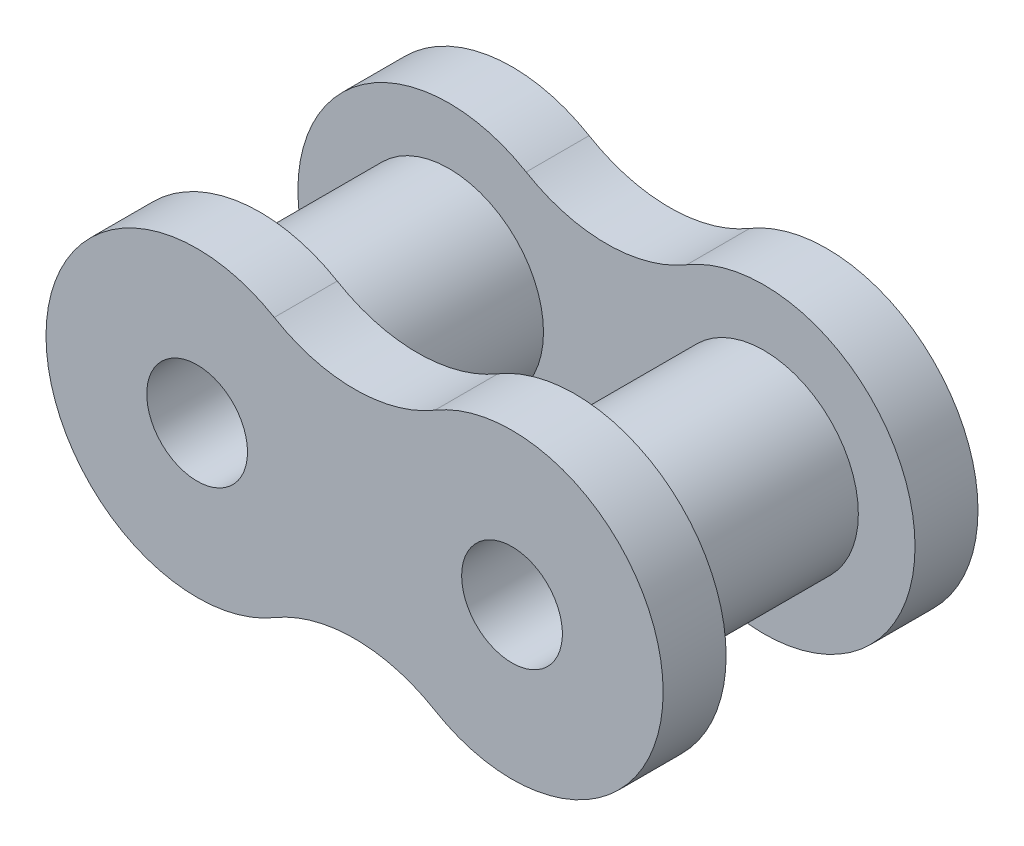
ISO-10303-21;
HEADER;
FILE_DESCRIPTION(('STEP AP214'),'2;1');
FILE_NAME('part.step','',(''),(''),'','','');
FILE_SCHEMA(('AUTOMOTIVE_DESIGN { 1 0 10303 214 1 1 1 1 }'));
ENDSEC;
DATA;
#1=APPLICATION_CONTEXT('core data for automotive mechanical design processes');
#2=APPLICATION_PROTOCOL_DEFINITION('international standard','automotive_design',2000,#1);
#3=PRODUCT_CONTEXT('',#1,'mechanical');
#4=PRODUCT('Part','Part','',(#3));
#5=PRODUCT_RELATED_PRODUCT_CATEGORY('part','',(#4));
#6=PRODUCT_DEFINITION_FORMATION('','',#4);
#7=PRODUCT_DEFINITION_CONTEXT('part definition',#1,'design');
#8=PRODUCT_DEFINITION('design','',#6,#7);
#9=PRODUCT_DEFINITION_SHAPE('','',#8);
#10=(LENGTH_UNIT() NAMED_UNIT(*) SI_UNIT(.MILLI.,.METRE.));
#11=(NAMED_UNIT(*) PLANE_ANGLE_UNIT() SI_UNIT($,.RADIAN.));
#12=(NAMED_UNIT(*) SI_UNIT($,.STERADIAN.) SOLID_ANGLE_UNIT());
#13=UNCERTAINTY_MEASURE_WITH_UNIT(LENGTH_MEASURE(1.E-05),#10,'distance_accuracy_value','');
#14=(GEOMETRIC_REPRESENTATION_CONTEXT(3) GLOBAL_UNCERTAINTY_ASSIGNED_CONTEXT((#13)) GLOBAL_UNIT_ASSIGNED_CONTEXT((#10,
#11,#12)) REPRESENTATION_CONTEXT('',''));
#15=CARTESIAN_POINT('',(0.,0.,0.));
#16=DIRECTION('',(0.,0.,1.));
#17=DIRECTION('',(1.,0.,0.));
#18=AXIS2_PLACEMENT_3D('',#15,#16,#17);
#19=CARTESIAN_POINT('',(0.125,0.210713075057055,0.));
#20=DIRECTION('',(0.,0.,1.));
#21=DIRECTION('',(1.,0.,0.));
#22=AXIS2_PLACEMENT_3D('',#19,#20,#21);
#23=PLANE('',#22);
#24=CARTESIAN_POINT('',(-0.25,0.,0.));
#25=DIRECTION('',(0.,0.,1.));
#26=DIRECTION('',(1.,0.,0.));
#27=AXIS2_PLACEMENT_3D('',#24,#25,#26);
#28=CIRCLE('',#27,0.15);
#29=CARTESIAN_POINT('',(-0.1,0.,0.));
#30=VERTEX_POINT('',#29);
#31=EDGE_CURVE('E180',#30,#30,#28,.T.);
#32=ORIENTED_EDGE('',*,*,#31,.F.);
#33=EDGE_LOOP('',(#32));
#34=FACE_BOUND('',#33,.T.);
#35=CARTESIAN_POINT('',(0.,0.42142615011411,0.));
#36=DIRECTION('',(0.,0.,-1.));
#37=DIRECTION('',(1.,0.,0.));
#38=AXIS2_PLACEMENT_3D('',#35,#36,#37);
#39=CIRCLE('',#38,0.25);
#40=CARTESIAN_POINT('',(0.127551020408163,0.206412808219156,0.));
#41=VERTEX_POINT('',#40);
#42=CARTESIAN_POINT('',(-0.127551020408163,0.206412808219156,0.));
#43=VERTEX_POINT('',#42);
#44=EDGE_CURVE('E199',#41,#43,#39,.T.);
#45=ORIENTED_EDGE('',*,*,#44,.T.);
#46=CARTESIAN_POINT('',(-0.25,0.,0.));
#47=DIRECTION('',(0.,0.,1.));
#48=DIRECTION('',(1.,0.,0.));
#49=AXIS2_PLACEMENT_3D('',#46,#47,#48);
#50=CIRCLE('',#49,0.24);
#51=CARTESIAN_POINT('',(-0.127551020408163,-0.206412808219156,0.));
#52=VERTEX_POINT('',#51);
#53=EDGE_CURVE('E216',#43,#52,#50,.T.);
#54=ORIENTED_EDGE('',*,*,#53,.T.);
#55=CARTESIAN_POINT('',(0.,-0.42142615011411,0.));
#56=DIRECTION('',(0.,0.,-1.));
#57=DIRECTION('',(-1.,0.,0.));
#58=AXIS2_PLACEMENT_3D('',#55,#56,#57);
#59=CIRCLE('',#58,0.25);
#60=CARTESIAN_POINT('',(0.127551020408163,-0.206412808219156,0.));
#61=VERTEX_POINT('',#60);
#62=EDGE_CURVE('E220',#52,#61,#59,.T.);
#63=ORIENTED_EDGE('',*,*,#62,.T.);
#64=CARTESIAN_POINT('',(0.25,0.,0.));
#65=DIRECTION('',(0.,0.,1.));
#66=DIRECTION('',(-1.,0.,0.));
#67=AXIS2_PLACEMENT_3D('',#64,#65,#66);
#68=CIRCLE('',#67,0.24);
#69=EDGE_CURVE('E204',#61,#41,#68,.T.);
#70=ORIENTED_EDGE('',*,*,#69,.T.);
#71=EDGE_LOOP('',(#45,#54,#63,#70));
#72=FACE_BOUND('',#71,.T.);
#73=CARTESIAN_POINT('',(0.25,0.,0.));
#74=DIRECTION('',(0.,0.,1.));
#75=DIRECTION('',(-1.,0.,0.));
#76=AXIS2_PLACEMENT_3D('',#73,#74,#75);
#77=CIRCLE('',#76,0.15);
#78=CARTESIAN_POINT('',(0.1,0.,0.));
#79=VERTEX_POINT('',#78);
#80=EDGE_CURVE('E176',#79,#79,#77,.T.);
#81=ORIENTED_EDGE('',*,*,#80,.F.);
#82=EDGE_LOOP('',(#81));
#83=FACE_BOUND('',#82,.T.);
#84=ADVANCED_FACE('F43',(#34,#72,#83),#23,.T.);
#85=CARTESIAN_POINT('',(0.,0.42142615011411,-0.1));
#86=DIRECTION('',(0.,0.,1.));
#87=DIRECTION('',(1.,0.,0.));
#88=AXIS2_PLACEMENT_3D('',#85,#86,#87);
#89=CYLINDRICAL_SURFACE('',#88,0.25);
#90=ORIENTED_EDGE('',*,*,#44,.F.);
#91=DIRECTION('',(0.,0.,1.));
#92=VECTOR('',#91,1.);
#93=CARTESIAN_POINT('',(0.127551020408163,0.206412808219156,-0.1));
#94=LINE('',#93,#92);
#95=CARTESIAN_POINT('',(0.127551020408163,0.206412808219156,-0.1));
#96=VERTEX_POINT('',#95);
#97=EDGE_CURVE('E11',#96,#41,#94,.T.);
#98=ORIENTED_EDGE('',*,*,#97,.F.);
#99=CARTESIAN_POINT('',(0.,0.42142615011411,-0.1));
#100=DIRECTION('',(0.,0.,-1.));
#101=DIRECTION('',(1.,0.,0.));
#102=AXIS2_PLACEMENT_3D('',#99,#100,#101);
#103=CIRCLE('',#102,0.25);
#104=CARTESIAN_POINT('',(-0.127551020408163,0.206412808219156,-0.1));
#105=VERTEX_POINT('',#104);
#106=EDGE_CURVE('E200',#96,#105,#103,.T.);
#107=ORIENTED_EDGE('',*,*,#106,.T.);
#108=DIRECTION('',(0.,0.,1.));
#109=VECTOR('',#108,1.);
#110=CARTESIAN_POINT('',(-0.127551020408163,0.206412808219156,-0.1));
#111=LINE('',#110,#109);
#112=EDGE_CURVE('E47',#105,#43,#111,.T.);
#113=ORIENTED_EDGE('',*,*,#112,.T.);
#114=EDGE_LOOP('',(#90,#98,#107,#113));
#115=FACE_BOUND('',#114,.T.);
#116=ADVANCED_FACE('F45',(#115),#89,.F.);
#117=CARTESIAN_POINT('',(0.25,0.,-0.1));
#118=DIRECTION('',(0.,0.,1.));
#119=DIRECTION('',(1.,0.,0.));
#120=AXIS2_PLACEMENT_3D('',#117,#118,#119);
#121=CYLINDRICAL_SURFACE('',#120,0.24);
#122=ORIENTED_EDGE('',*,*,#69,.F.);
#123=DIRECTION('',(0.,0.,1.));
#124=VECTOR('',#123,1.);
#125=CARTESIAN_POINT('',(0.127551020408163,-0.206412808219156,-0.1));
#126=LINE('',#125,#124);
#127=CARTESIAN_POINT('',(0.127551020408163,-0.206412808219156,-0.1));
#128=VERTEX_POINT('',#127);
#129=EDGE_CURVE('E54',#128,#61,#126,.T.);
#130=ORIENTED_EDGE('',*,*,#129,.F.);
#131=CARTESIAN_POINT('',(0.25,0.,-0.1));
#132=DIRECTION('',(0.,0.,1.));
#133=DIRECTION('',(-1.,0.,0.));
#134=AXIS2_PLACEMENT_3D('',#131,#132,#133);
#135=CIRCLE('',#134,0.24);
#136=EDGE_CURVE('E210',#128,#96,#135,.T.);
#137=ORIENTED_EDGE('',*,*,#136,.T.);
#138=ORIENTED_EDGE('',*,*,#97,.T.);
#139=EDGE_LOOP('',(#122,#130,#137,#138));
#140=FACE_BOUND('',#139,.T.);
#141=ADVANCED_FACE('F233',(#140),#121,.T.);
#142=CARTESIAN_POINT('',(0.,-0.42142615011411,-0.1));
#143=DIRECTION('',(0.,0.,1.));
#144=DIRECTION('',(1.,0.,0.));
#145=AXIS2_PLACEMENT_3D('',#142,#143,#144);
#146=CYLINDRICAL_SURFACE('',#145,0.25);
#147=ORIENTED_EDGE('',*,*,#62,.F.);
#148=DIRECTION('',(0.,0.,1.));
#149=VECTOR('',#148,1.);
#150=CARTESIAN_POINT('',(-0.127551020408163,-0.206412808219156,-0.1));
#151=LINE('',#150,#149);
#152=CARTESIAN_POINT('',(-0.127551020408163,-0.206412808219156,-0.1));
#153=VERTEX_POINT('',#152);
#154=EDGE_CURVE('E227',#153,#52,#151,.T.);
#155=ORIENTED_EDGE('',*,*,#154,.F.);
#156=CARTESIAN_POINT('',(0.,-0.42142615011411,-0.1));
#157=DIRECTION('',(0.,0.,-1.));
#158=DIRECTION('',(-1.,0.,0.));
#159=AXIS2_PLACEMENT_3D('',#156,#157,#158);
#160=CIRCLE('',#159,0.25);
#161=EDGE_CURVE('E207',#153,#128,#160,.T.);
#162=ORIENTED_EDGE('',*,*,#161,.T.);
#163=ORIENTED_EDGE('',*,*,#129,.T.);
#164=EDGE_LOOP('',(#147,#155,#162,#163));
#165=FACE_BOUND('',#164,.T.);
#166=ADVANCED_FACE('F236',(#165),#146,.F.);
#167=CARTESIAN_POINT('',(-0.25,0.,-0.1));
#168=DIRECTION('',(0.,0.,1.));
#169=DIRECTION('',(1.,0.,0.));
#170=AXIS2_PLACEMENT_3D('',#167,#168,#169);
#171=CYLINDRICAL_SURFACE('',#170,0.24);
#172=ORIENTED_EDGE('',*,*,#53,.F.);
#173=ORIENTED_EDGE('',*,*,#112,.F.);
#174=CARTESIAN_POINT('',(-0.25,0.,-0.1));
#175=DIRECTION('',(0.,0.,1.));
#176=DIRECTION('',(1.,0.,0.));
#177=AXIS2_PLACEMENT_3D('',#174,#175,#176);
#178=CIRCLE('',#177,0.24);
#179=EDGE_CURVE('E203',#105,#153,#178,.T.);
#180=ORIENTED_EDGE('',*,*,#179,.T.);
#181=ORIENTED_EDGE('',*,*,#154,.T.);
#182=EDGE_LOOP('',(#172,#173,#180,#181));
#183=FACE_BOUND('',#182,.T.);
#184=ADVANCED_FACE('F230',(#183),#171,.T.);
#185=CARTESIAN_POINT('',(0.125,0.210713075057055,-0.1));
#186=DIRECTION('',(0.,0.,1.));
#187=DIRECTION('',(1.,0.,0.));
#188=AXIS2_PLACEMENT_3D('',#185,#186,#187);
#189=PLANE('',#188);
#190=CARTESIAN_POINT('',(0.25,0.,-0.1));
#191=DIRECTION('',(0.,0.,1.));
#192=DIRECTION('',(-1.,0.,0.));
#193=AXIS2_PLACEMENT_3D('',#190,#191,#192);
#194=CIRCLE('',#193,0.08);
#195=CARTESIAN_POINT('',(0.17,0.,-0.1));
#196=VERTEX_POINT('',#195);
#197=EDGE_CURVE('E188',#196,#196,#194,.T.);
#198=ORIENTED_EDGE('',*,*,#197,.T.);
#199=EDGE_LOOP('',(#198));
#200=FACE_BOUND('',#199,.T.);
#201=CARTESIAN_POINT('',(-0.25,0.,-0.1));
#202=DIRECTION('',(0.,0.,1.));
#203=DIRECTION('',(1.,0.,0.));
#204=AXIS2_PLACEMENT_3D('',#201,#202,#203);
#205=CIRCLE('',#204,0.08);
#206=CARTESIAN_POINT('',(-0.17,0.,-0.1));
#207=VERTEX_POINT('',#206);
#208=EDGE_CURVE('E195',#207,#207,#205,.T.);
#209=ORIENTED_EDGE('',*,*,#208,.T.);
#210=EDGE_LOOP('',(#209));
#211=FACE_BOUND('',#210,.T.);
#212=ORIENTED_EDGE('',*,*,#106,.F.);
#213=ORIENTED_EDGE('',*,*,#136,.F.);
#214=ORIENTED_EDGE('',*,*,#161,.F.);
#215=ORIENTED_EDGE('',*,*,#179,.F.);
#216=EDGE_LOOP('',(#212,#213,#214,#215));
#217=FACE_BOUND('',#216,.T.);
#218=ADVANCED_FACE('F238',(#200,#211,#217),#189,.F.);
#219=CARTESIAN_POINT('',(-0.25,0.,-0.1));
#220=DIRECTION('',(0.,0.,1.));
#221=DIRECTION('',(1.,0.,0.));
#222=AXIS2_PLACEMENT_3D('',#219,#220,#221);
#223=CYLINDRICAL_SURFACE('',#222,0.08);
#224=ORIENTED_EDGE('',*,*,#208,.F.);
#225=EDGE_LOOP('',(#224));
#226=FACE_BOUND('',#225,.T.);
#227=CARTESIAN_POINT('',(-0.25,0.,0.4));
#228=DIRECTION('',(0.,0.,1.));
#229=DIRECTION('',(1.,0.,0.));
#230=AXIS2_PLACEMENT_3D('',#227,#228,#229);
#231=CIRCLE('',#230,0.08);
#232=CARTESIAN_POINT('',(-0.17,0.,0.4));
#233=VERTEX_POINT('',#232);
#234=EDGE_CURVE('E153',#233,#233,#231,.T.);
#235=ORIENTED_EDGE('',*,*,#234,.T.);
#236=EDGE_LOOP('',(#235));
#237=FACE_BOUND('',#236,.T.);
#238=ADVANCED_FACE('F240',(#226,#237),#223,.F.);
#239=CARTESIAN_POINT('',(0.25,0.,-0.1));
#240=DIRECTION('',(0.,0.,1.));
#241=DIRECTION('',(1.,0.,0.));
#242=AXIS2_PLACEMENT_3D('',#239,#240,#241);
#243=CYLINDRICAL_SURFACE('',#242,0.08);
#244=ORIENTED_EDGE('',*,*,#197,.F.);
#245=EDGE_LOOP('',(#244));
#246=FACE_BOUND('',#245,.T.);
#247=CARTESIAN_POINT('',(0.25,0.,0.4));
#248=DIRECTION('',(0.,0.,1.));
#249=DIRECTION('',(-1.,0.,0.));
#250=AXIS2_PLACEMENT_3D('',#247,#248,#249);
#251=CIRCLE('',#250,0.08);
#252=CARTESIAN_POINT('',(0.17,0.,0.4));
#253=VERTEX_POINT('',#252);
#254=EDGE_CURVE('E440',#253,#253,#251,.T.);
#255=ORIENTED_EDGE('',*,*,#254,.T.);
#256=EDGE_LOOP('',(#255));
#257=FACE_BOUND('',#256,.T.);
#258=ADVANCED_FACE('F247',(#246,#257),#243,.F.);
#259=CARTESIAN_POINT('',(-0.25,0.,0.3));
#260=DIRECTION('',(0.,0.,-1.));
#261=DIRECTION('',(-1.,0.,0.));
#262=AXIS2_PLACEMENT_3D('',#259,#260,#261);
#263=CYLINDRICAL_SURFACE('',#262,0.15);
#264=CARTESIAN_POINT('',(-0.25,0.,0.3));
#265=DIRECTION('',(0.,0.,1.));
#266=DIRECTION('',(1.,0.,0.));
#267=AXIS2_PLACEMENT_3D('',#264,#265,#266);
#268=CIRCLE('',#267,0.15);
#269=CARTESIAN_POINT('',(-0.1,0.,0.3));
#270=VERTEX_POINT('',#269);
#271=EDGE_CURVE('E184',#270,#270,#268,.T.);
#272=ORIENTED_EDGE('',*,*,#271,.F.);
#273=EDGE_LOOP('',(#272));
#274=FACE_BOUND('',#273,.T.);
#275=ORIENTED_EDGE('',*,*,#31,.T.);
#276=EDGE_LOOP('',(#275));
#277=FACE_BOUND('',#276,.T.);
#278=ADVANCED_FACE('F289',(#274,#277),#263,.T.);
#279=CARTESIAN_POINT('',(0.25,0.,0.3));
#280=DIRECTION('',(0.,0.,-1.));
#281=DIRECTION('',(-1.,0.,0.));
#282=AXIS2_PLACEMENT_3D('',#279,#280,#281);
#283=CYLINDRICAL_SURFACE('',#282,0.15);
#284=CARTESIAN_POINT('',(0.25,0.,0.3));
#285=DIRECTION('',(0.,0.,1.));
#286=DIRECTION('',(-1.,0.,0.));
#287=AXIS2_PLACEMENT_3D('',#284,#285,#286);
#288=CIRCLE('',#287,0.15);
#289=CARTESIAN_POINT('',(0.1,0.,0.3));
#290=VERTEX_POINT('',#289);
#291=EDGE_CURVE('E169',#290,#290,#288,.T.);
#292=ORIENTED_EDGE('',*,*,#291,.F.);
#293=EDGE_LOOP('',(#292));
#294=FACE_BOUND('',#293,.T.);
#295=ORIENTED_EDGE('',*,*,#80,.T.);
#296=EDGE_LOOP('',(#295));
#297=FACE_BOUND('',#296,.T.);
#298=ADVANCED_FACE('F294',(#294,#297),#283,.T.);
#299=CARTESIAN_POINT('',(0.125,0.210713075057055,0.4));
#300=DIRECTION('',(0.,0.,-1.));
#301=DIRECTION('',(1.,0.,0.));
#302=AXIS2_PLACEMENT_3D('',#299,#300,#301);
#303=PLANE('',#302);
#304=CARTESIAN_POINT('',(0.,0.42142615011411,0.4));
#305=DIRECTION('',(0.,0.,-1.));
#306=DIRECTION('',(1.,0.,0.));
#307=AXIS2_PLACEMENT_3D('',#304,#305,#306);
#308=CIRCLE('',#307,0.25);
#309=CARTESIAN_POINT('',(0.127551020408163,0.206412808219156,0.4));
#310=VERTEX_POINT('',#309);
#311=CARTESIAN_POINT('',(-0.127551020408163,0.206412808219156,0.4));
#312=VERTEX_POINT('',#311);
#313=EDGE_CURVE('E122',#310,#312,#308,.T.);
#314=ORIENTED_EDGE('',*,*,#313,.T.);
#315=CARTESIAN_POINT('',(-0.25,0.,0.4));
#316=DIRECTION('',(0.,0.,1.));
#317=DIRECTION('',(1.,0.,0.));
#318=AXIS2_PLACEMENT_3D('',#315,#316,#317);
#319=CIRCLE('',#318,0.24);
#320=CARTESIAN_POINT('',(-0.127551020408163,-0.206412808219156,0.4));
#321=VERTEX_POINT('',#320);
#322=EDGE_CURVE('E141',#312,#321,#319,.T.);
#323=ORIENTED_EDGE('',*,*,#322,.T.);
#324=CARTESIAN_POINT('',(0.,-0.42142615011411,0.4));
#325=DIRECTION('',(0.,0.,-1.));
#326=DIRECTION('',(-1.,0.,0.));
#327=AXIS2_PLACEMENT_3D('',#324,#325,#326);
#328=CIRCLE('',#327,0.25);
#329=CARTESIAN_POINT('',(0.127551020408163,-0.206412808219156,0.4));
#330=VERTEX_POINT('',#329);
#331=EDGE_CURVE('E125',#321,#330,#328,.T.);
#332=ORIENTED_EDGE('',*,*,#331,.T.);
#333=CARTESIAN_POINT('',(0.25,0.,0.4));
#334=DIRECTION('',(0.,0.,1.));
#335=DIRECTION('',(-1.,0.,0.));
#336=AXIS2_PLACEMENT_3D('',#333,#334,#335);
#337=CIRCLE('',#336,0.24);
#338=EDGE_CURVE('E117',#330,#310,#337,.T.);
#339=ORIENTED_EDGE('',*,*,#338,.T.);
#340=EDGE_LOOP('',(#314,#323,#332,#339));
#341=FACE_BOUND('',#340,.T.);
#342=ORIENTED_EDGE('',*,*,#234,.F.);
#343=EDGE_LOOP('',(#342));
#344=FACE_BOUND('',#343,.T.);
#345=ORIENTED_EDGE('',*,*,#254,.F.);
#346=EDGE_LOOP('',(#345));
#347=FACE_BOUND('',#346,.T.);
#348=ADVANCED_FACE('F119',(#341,#344,#347),#303,.F.);
#349=CARTESIAN_POINT('',(0.125,0.210713075057055,0.3));
#350=DIRECTION('',(0.,0.,-1.));
#351=DIRECTION('',(1.,0.,0.));
#352=AXIS2_PLACEMENT_3D('',#349,#350,#351);
#353=PLANE('',#352);
#354=ORIENTED_EDGE('',*,*,#271,.T.);
#355=EDGE_LOOP('',(#354));
#356=FACE_BOUND('',#355,.T.);
#357=ORIENTED_EDGE('',*,*,#291,.T.);
#358=EDGE_LOOP('',(#357));
#359=FACE_BOUND('',#358,.T.);
#360=CARTESIAN_POINT('',(0.,0.42142615011411,0.3));
#361=DIRECTION('',(0.,0.,-1.));
#362=DIRECTION('',(1.,0.,0.));
#363=AXIS2_PLACEMENT_3D('',#360,#361,#362);
#364=CIRCLE('',#363,0.25);
#365=CARTESIAN_POINT('',(0.127551020408163,0.206412808219156,0.3));
#366=VERTEX_POINT('',#365);
#367=CARTESIAN_POINT('',(-0.127551020408163,0.206412808219156,0.3));
#368=VERTEX_POINT('',#367);
#369=EDGE_CURVE('E160',#366,#368,#364,.T.);
#370=ORIENTED_EDGE('',*,*,#369,.F.);
#371=CARTESIAN_POINT('',(0.25,0.,0.3));
#372=DIRECTION('',(0.,0.,1.));
#373=DIRECTION('',(-1.,0.,0.));
#374=AXIS2_PLACEMENT_3D('',#371,#372,#373);
#375=CIRCLE('',#374,0.24);
#376=CARTESIAN_POINT('',(0.127551020408163,-0.206412808219156,0.3));
#377=VERTEX_POINT('',#376);
#378=EDGE_CURVE('E135',#377,#366,#375,.T.);
#379=ORIENTED_EDGE('',*,*,#378,.F.);
#380=CARTESIAN_POINT('',(0.,-0.42142615011411,0.3));
#381=DIRECTION('',(0.,0.,-1.));
#382=DIRECTION('',(-1.,0.,0.));
#383=AXIS2_PLACEMENT_3D('',#380,#381,#382);
#384=CIRCLE('',#383,0.25);
#385=CARTESIAN_POINT('',(-0.127551020408163,-0.206412808219156,0.3));
#386=VERTEX_POINT('',#385);
#387=EDGE_CURVE('E150',#386,#377,#384,.T.);
#388=ORIENTED_EDGE('',*,*,#387,.F.);
#389=CARTESIAN_POINT('',(-0.25,0.,0.3));
#390=DIRECTION('',(0.,0.,1.));
#391=DIRECTION('',(1.,0.,0.));
#392=AXIS2_PLACEMENT_3D('',#389,#390,#391);
#393=CIRCLE('',#392,0.24);
#394=EDGE_CURVE('E147',#368,#386,#393,.T.);
#395=ORIENTED_EDGE('',*,*,#394,.F.);
#396=EDGE_LOOP('',(#370,#379,#388,#395));
#397=FACE_BOUND('',#396,.T.);
#398=ADVANCED_FACE('F331',(#356,#359,#397),#353,.T.);
#399=CARTESIAN_POINT('',(0.,0.42142615011411,0.4));
#400=DIRECTION('',(0.,0.,-1.));
#401=DIRECTION('',(-1.,0.,0.));
#402=AXIS2_PLACEMENT_3D('',#399,#400,#401);
#403=CYLINDRICAL_SURFACE('',#402,0.25);
#404=ORIENTED_EDGE('',*,*,#369,.T.);
#405=DIRECTION('',(0.,0.,-1.));
#406=VECTOR('',#405,1.);
#407=CARTESIAN_POINT('',(-0.127551020408163,0.206412808219156,0.4));
#408=LINE('',#407,#406);
#409=EDGE_CURVE('E145',#312,#368,#408,.T.);
#410=ORIENTED_EDGE('',*,*,#409,.F.);
#411=ORIENTED_EDGE('',*,*,#313,.F.);
#412=DIRECTION('',(0.,0.,-1.));
#413=VECTOR('',#412,1.);
#414=CARTESIAN_POINT('',(0.127551020408163,0.206412808219156,0.4));
#415=LINE('',#414,#413);
#416=EDGE_CURVE('E132',#310,#366,#415,.T.);
#417=ORIENTED_EDGE('',*,*,#416,.T.);
#418=EDGE_LOOP('',(#404,#410,#411,#417));
#419=FACE_BOUND('',#418,.T.);
#420=ADVANCED_FACE('F143',(#419),#403,.F.);
#421=CARTESIAN_POINT('',(-0.25,0.,0.4));
#422=DIRECTION('',(0.,0.,-1.));
#423=DIRECTION('',(-1.,0.,0.));
#424=AXIS2_PLACEMENT_3D('',#421,#422,#423);
#425=CYLINDRICAL_SURFACE('',#424,0.24);
#426=ORIENTED_EDGE('',*,*,#394,.T.);
#427=DIRECTION('',(0.,0.,-1.));
#428=VECTOR('',#427,1.);
#429=CARTESIAN_POINT('',(-0.127551020408163,-0.206412808219156,0.4));
#430=LINE('',#429,#428);
#431=EDGE_CURVE('E170',#321,#386,#430,.T.);
#432=ORIENTED_EDGE('',*,*,#431,.F.);
#433=ORIENTED_EDGE('',*,*,#322,.F.);
#434=ORIENTED_EDGE('',*,*,#409,.T.);
#435=EDGE_LOOP('',(#426,#432,#433,#434));
#436=FACE_BOUND('',#435,.T.);
#437=ADVANCED_FACE('F351',(#436),#425,.T.);
#438=CARTESIAN_POINT('',(0.,-0.42142615011411,0.4));
#439=DIRECTION('',(0.,0.,-1.));
#440=DIRECTION('',(-1.,0.,0.));
#441=AXIS2_PLACEMENT_3D('',#438,#439,#440);
#442=CYLINDRICAL_SURFACE('',#441,0.25);
#443=ORIENTED_EDGE('',*,*,#387,.T.);
#444=DIRECTION('',(0.,0.,-1.));
#445=VECTOR('',#444,1.);
#446=CARTESIAN_POINT('',(0.127551020408163,-0.206412808219156,0.4));
#447=LINE('',#446,#445);
#448=EDGE_CURVE('E140',#330,#377,#447,.T.);
#449=ORIENTED_EDGE('',*,*,#448,.F.);
#450=ORIENTED_EDGE('',*,*,#331,.F.);
#451=ORIENTED_EDGE('',*,*,#431,.T.);
#452=EDGE_LOOP('',(#443,#449,#450,#451));
#453=FACE_BOUND('',#452,.T.);
#454=ADVANCED_FACE('F361',(#453),#442,.F.);
#455=CARTESIAN_POINT('',(0.25,0.,0.4));
#456=DIRECTION('',(0.,0.,-1.));
#457=DIRECTION('',(-1.,0.,0.));
#458=AXIS2_PLACEMENT_3D('',#455,#456,#457);
#459=CYLINDRICAL_SURFACE('',#458,0.24);
#460=ORIENTED_EDGE('',*,*,#378,.T.);
#461=ORIENTED_EDGE('',*,*,#416,.F.);
#462=ORIENTED_EDGE('',*,*,#338,.F.);
#463=ORIENTED_EDGE('',*,*,#448,.T.);
#464=EDGE_LOOP('',(#460,#461,#462,#463));
#465=FACE_BOUND('',#464,.T.);
#466=ADVANCED_FACE('F133',(#465),#459,.T.);
#467=CLOSED_SHELL('',(#84,#116,#141,#166,#184,#218,#238,#258,#278,#298,#348,#398,#420,#437,#454,#466));
#468=MANIFOLD_SOLID_BREP('B2',#467);
#469=ADVANCED_BREP_SHAPE_REPRESENTATION('',(#18,#468),#14);
#470=SHAPE_DEFINITION_REPRESENTATION(#9,#469);
ENDSEC;
END-ISO-10303-21;
